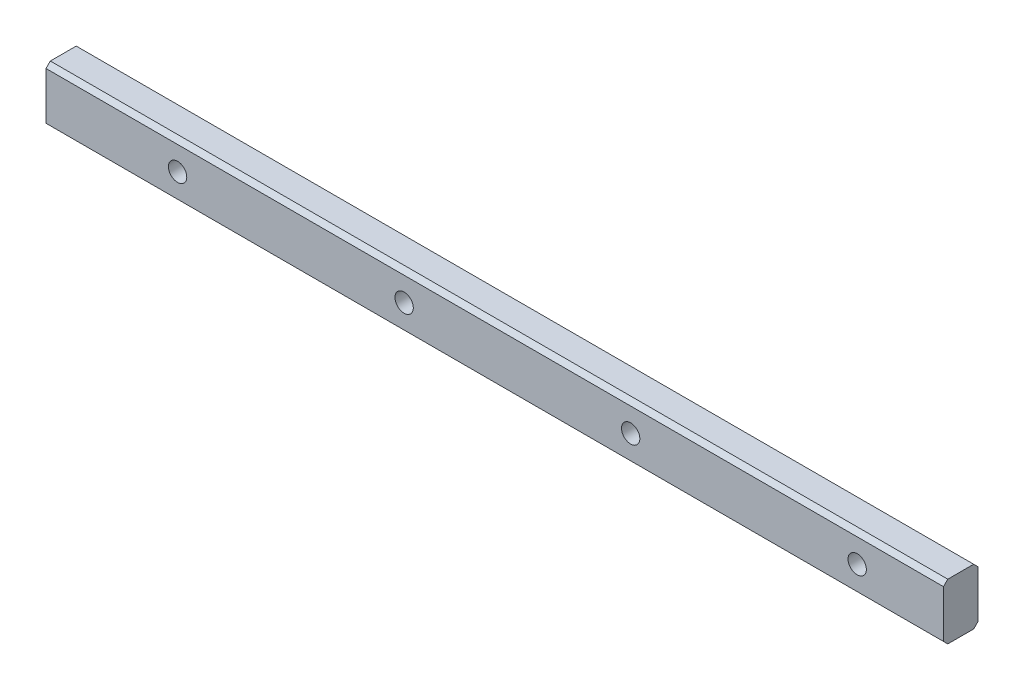
ISO-10303-21;
HEADER;
FILE_DESCRIPTION(('STEP AP214'),'2;1');
FILE_NAME('part.step','',(''),(''),'','','');
FILE_SCHEMA(('AUTOMOTIVE_DESIGN { 1 0 10303 214 1 1 1 1 }'));
ENDSEC;
DATA;
#1=APPLICATION_CONTEXT('core data for automotive mechanical design processes');
#2=APPLICATION_PROTOCOL_DEFINITION('international standard','automotive_design',2000,#1);
#3=PRODUCT_CONTEXT('',#1,'mechanical');
#4=PRODUCT('Part','Part','',(#3));
#5=PRODUCT_RELATED_PRODUCT_CATEGORY('part','',(#4));
#6=PRODUCT_DEFINITION_FORMATION('','',#4);
#7=PRODUCT_DEFINITION_CONTEXT('part definition',#1,'design');
#8=PRODUCT_DEFINITION('design','',#6,#7);
#9=PRODUCT_DEFINITION_SHAPE('','',#8);
#10=(LENGTH_UNIT() NAMED_UNIT(*) SI_UNIT(.MILLI.,.METRE.));
#11=(NAMED_UNIT(*) PLANE_ANGLE_UNIT() SI_UNIT($,.RADIAN.));
#12=(NAMED_UNIT(*) SI_UNIT($,.STERADIAN.) SOLID_ANGLE_UNIT());
#13=UNCERTAINTY_MEASURE_WITH_UNIT(LENGTH_MEASURE(1.E-05),#10,'distance_accuracy_value','');
#14=(GEOMETRIC_REPRESENTATION_CONTEXT(3) GLOBAL_UNCERTAINTY_ASSIGNED_CONTEXT((#13)) GLOBAL_UNIT_ASSIGNED_CONTEXT((#10,
#11,#12)) REPRESENTATION_CONTEXT('',''));
#15=CARTESIAN_POINT('',(0.,0.,0.));
#16=DIRECTION('',(0.,0.,1.));
#17=DIRECTION('',(1.,0.,0.));
#18=AXIS2_PLACEMENT_3D('',#15,#16,#17);
#19=CARTESIAN_POINT('',(208.,14.0000000000001,16.));
#20=DIRECTION('',(-1.,0.,0.));
#21=DIRECTION('',(0.,0.,1.));
#22=AXIS2_PLACEMENT_3D('',#19,#20,#21);
#23=PLANE('',#22);
#24=DIRECTION('',(0.,0.,-1.));
#25=VECTOR('',#24,1.);
#26=CARTESIAN_POINT('',(208.,-13.,16.));
#27=LINE('',#26,#25);
#28=CARTESIAN_POINT('',(208.,-13.,14.0000000000001));
#29=VERTEX_POINT('',#28);
#30=CARTESIAN_POINT('',(208.,-13.,2.));
#31=VERTEX_POINT('',#30);
#32=EDGE_CURVE('E106',#29,#31,#27,.T.);
#33=ORIENTED_EDGE('',*,*,#32,.T.);
#34=DIRECTION('',(0.,-0.707106781186548,0.707106781186548));
#35=VECTOR('',#34,1.);
#36=CARTESIAN_POINT('',(208.,-11.,0.));
#37=LINE('',#36,#35);
#38=CARTESIAN_POINT('',(208.,-11.,0.));
#39=VERTEX_POINT('',#38);
#40=EDGE_CURVE('E102',#31,#39,#37,.F.);
#41=ORIENTED_EDGE('',*,*,#40,.T.);
#42=DIRECTION('',(0.,1.,0.));
#43=VECTOR('',#42,1.);
#44=CARTESIAN_POINT('',(208.,14.0000000000001,0.));
#45=LINE('',#44,#43);
#46=CARTESIAN_POINT('',(208.,11.,0.));
#47=VERTEX_POINT('',#46);
#48=EDGE_CURVE('E104',#39,#47,#45,.T.);
#49=ORIENTED_EDGE('',*,*,#48,.T.);
#50=DIRECTION('',(0.,-0.707106781186548,-0.707106781186547));
#51=VECTOR('',#50,1.);
#52=CARTESIAN_POINT('',(208.,13.,1.99999999999995));
#53=LINE('',#52,#51);
#54=CARTESIAN_POINT('',(208.,13.,1.99999999999995));
#55=VERTEX_POINT('',#54);
#56=EDGE_CURVE('E59',#47,#55,#53,.F.);
#57=ORIENTED_EDGE('',*,*,#56,.T.);
#58=DIRECTION('',(0.,0.,1.));
#59=VECTOR('',#58,1.);
#60=CARTESIAN_POINT('',(208.,13.,16.));
#61=LINE('',#60,#59);
#62=CARTESIAN_POINT('',(208.,13.,14.));
#63=VERTEX_POINT('',#62);
#64=EDGE_CURVE('E120',#55,#63,#61,.T.);
#65=ORIENTED_EDGE('',*,*,#64,.T.);
#66=DIRECTION('',(0.,-0.707106781186548,0.707106781186547));
#67=VECTOR('',#66,1.);
#68=CARTESIAN_POINT('',(208.,11.,16.));
#69=LINE('',#68,#67);
#70=CARTESIAN_POINT('',(208.,11.,16.));
#71=VERTEX_POINT('',#70);
#72=EDGE_CURVE('E141',#63,#71,#69,.T.);
#73=ORIENTED_EDGE('',*,*,#72,.T.);
#74=DIRECTION('',(0.,1.,0.));
#75=VECTOR('',#74,1.);
#76=CARTESIAN_POINT('',(208.,14.0000000000001,16.));
#77=LINE('',#76,#75);
#78=CARTESIAN_POINT('',(208.,-11.0000000000001,16.));
#79=VERTEX_POINT('',#78);
#80=EDGE_CURVE('E158',#79,#71,#77,.T.);
#81=ORIENTED_EDGE('',*,*,#80,.F.);
#82=DIRECTION('',(0.,-0.707106781186548,-0.707106781186548));
#83=VECTOR('',#82,1.);
#84=CARTESIAN_POINT('',(208.,-13.,14.0000000000001));
#85=LINE('',#84,#83);
#86=EDGE_CURVE('E143',#79,#29,#85,.T.);
#87=ORIENTED_EDGE('',*,*,#86,.T.);
#88=EDGE_LOOP('',(#33,#41,#49,#57,#65,#73,#81,#87));
#89=FACE_BOUND('',#88,.T.);
#90=ADVANCED_FACE('F37',(#89),#23,.F.);
#91=CARTESIAN_POINT('',(-208.,14.,16.));
#92=DIRECTION('',(1.,0.,0.));
#93=DIRECTION('',(0.,0.,-1.));
#94=AXIS2_PLACEMENT_3D('',#91,#92,#93);
#95=PLANE('',#94);
#96=DIRECTION('',(0.,-1.,0.));
#97=VECTOR('',#96,1.);
#98=CARTESIAN_POINT('',(-208.,14.,0.));
#99=LINE('',#98,#97);
#100=CARTESIAN_POINT('',(-208.,11.,0.));
#101=VERTEX_POINT('',#100);
#102=CARTESIAN_POINT('',(-208.,-11.,0.));
#103=VERTEX_POINT('',#102);
#104=EDGE_CURVE('E119',#101,#103,#99,.T.);
#105=ORIENTED_EDGE('',*,*,#104,.T.);
#106=DIRECTION('',(0.,0.707106781186548,-0.707106781186548));
#107=VECTOR('',#106,1.);
#108=CARTESIAN_POINT('',(-208.,-11.,0.));
#109=LINE('',#108,#107);
#110=CARTESIAN_POINT('',(-208.,-13.,2.));
#111=VERTEX_POINT('',#110);
#112=EDGE_CURVE('E123',#103,#111,#109,.F.);
#113=ORIENTED_EDGE('',*,*,#112,.T.);
#114=DIRECTION('',(0.,0.,-1.));
#115=VECTOR('',#114,1.);
#116=CARTESIAN_POINT('',(-208.,-13.,16.));
#117=LINE('',#116,#115);
#118=CARTESIAN_POINT('',(-208.,-13.,14.0000000000001));
#119=VERTEX_POINT('',#118);
#120=EDGE_CURVE('E175',#119,#111,#117,.T.);
#121=ORIENTED_EDGE('',*,*,#120,.F.);
#122=DIRECTION('',(0.,0.707106781186548,0.707106781186548));
#123=VECTOR('',#122,1.);
#124=CARTESIAN_POINT('',(-208.,-13.,14.0000000000001));
#125=LINE('',#124,#123);
#126=CARTESIAN_POINT('',(-208.,-11.0000000000001,16.));
#127=VERTEX_POINT('',#126);
#128=EDGE_CURVE('E126',#119,#127,#125,.T.);
#129=ORIENTED_EDGE('',*,*,#128,.T.);
#130=DIRECTION('',(0.,-1.,0.));
#131=VECTOR('',#130,1.);
#132=CARTESIAN_POINT('',(-208.,14.,16.));
#133=LINE('',#132,#131);
#134=CARTESIAN_POINT('',(-208.,11.,16.));
#135=VERTEX_POINT('',#134);
#136=EDGE_CURVE('E128',#135,#127,#133,.T.);
#137=ORIENTED_EDGE('',*,*,#136,.F.);
#138=DIRECTION('',(0.,0.707106781186548,-0.707106781186547));
#139=VECTOR('',#138,1.);
#140=CARTESIAN_POINT('',(-208.,11.,16.));
#141=LINE('',#140,#139);
#142=CARTESIAN_POINT('',(-208.,13.,14.));
#143=VERTEX_POINT('',#142);
#144=EDGE_CURVE('E124',#135,#143,#141,.T.);
#145=ORIENTED_EDGE('',*,*,#144,.T.);
#146=DIRECTION('',(0.,0.,1.));
#147=VECTOR('',#146,1.);
#148=CARTESIAN_POINT('',(-208.,13.,16.));
#149=LINE('',#148,#147);
#150=CARTESIAN_POINT('',(-208.,13.,1.99999999999995));
#151=VERTEX_POINT('',#150);
#152=EDGE_CURVE('E173',#151,#143,#149,.T.);
#153=ORIENTED_EDGE('',*,*,#152,.F.);
#154=DIRECTION('',(0.,0.707106781186548,0.707106781186547));
#155=VECTOR('',#154,1.);
#156=CARTESIAN_POINT('',(-208.,13.,1.99999999999995));
#157=LINE('',#156,#155);
#158=EDGE_CURVE('E133',#151,#101,#157,.F.);
#159=ORIENTED_EDGE('',*,*,#158,.T.);
#160=EDGE_LOOP('',(#105,#113,#121,#129,#137,#145,#153,#159));
#161=FACE_BOUND('',#160,.T.);
#162=ADVANCED_FACE('F162',(#161),#95,.F.);
#163=CARTESIAN_POINT('',(208.,-14.0000000000001,16.));
#164=DIRECTION('',(0.,0.,1.));
#165=DIRECTION('',(1.,0.,0.));
#166=AXIS2_PLACEMENT_3D('',#163,#164,#165);
#167=PLANE('',#166);
#168=CARTESIAN_POINT('',(-147.,0.,16.));
#169=DIRECTION('',(0.,0.,1.));
#170=DIRECTION('',(1.,0.,0.));
#171=AXIS2_PLACEMENT_3D('',#168,#169,#170);
#172=CIRCLE('',#171,4.24999999999998);
#173=CARTESIAN_POINT('',(-142.75,0.,16.));
#174=VERTEX_POINT('',#173);
#175=EDGE_CURVE('E200',#174,#174,#172,.T.);
#176=ORIENTED_EDGE('',*,*,#175,.F.);
#177=EDGE_LOOP('',(#176));
#178=FACE_BOUND('',#177,.T.);
#179=CARTESIAN_POINT('',(-42.,0.,16.));
#180=DIRECTION('',(0.,0.,1.));
#181=DIRECTION('',(1.,0.,0.));
#182=AXIS2_PLACEMENT_3D('',#179,#180,#181);
#183=CIRCLE('',#182,4.24999999999996);
#184=CARTESIAN_POINT('',(-37.75,0.,16.));
#185=VERTEX_POINT('',#184);
#186=EDGE_CURVE('E194',#185,#185,#183,.T.);
#187=ORIENTED_EDGE('',*,*,#186,.F.);
#188=EDGE_LOOP('',(#187));
#189=FACE_BOUND('',#188,.T.);
#190=CARTESIAN_POINT('',(63.,0.,16.));
#191=DIRECTION('',(0.,0.,1.));
#192=DIRECTION('',(1.,0.,0.));
#193=AXIS2_PLACEMENT_3D('',#190,#191,#192);
#194=CIRCLE('',#193,4.24999999999996);
#195=CARTESIAN_POINT('',(67.2499999999999,0.,16.));
#196=VERTEX_POINT('',#195);
#197=EDGE_CURVE('E188',#196,#196,#194,.T.);
#198=ORIENTED_EDGE('',*,*,#197,.F.);
#199=EDGE_LOOP('',(#198));
#200=FACE_BOUND('',#199,.T.);
#201=CARTESIAN_POINT('',(168.,0.,16.));
#202=DIRECTION('',(0.,0.,1.));
#203=DIRECTION('',(1.,0.,0.));
#204=AXIS2_PLACEMENT_3D('',#201,#202,#203);
#205=CIRCLE('',#204,4.24999999999998);
#206=CARTESIAN_POINT('',(172.25,0.,16.));
#207=VERTEX_POINT('',#206);
#208=EDGE_CURVE('E182',#207,#207,#205,.T.);
#209=ORIENTED_EDGE('',*,*,#208,.F.);
#210=EDGE_LOOP('',(#209));
#211=FACE_BOUND('',#210,.T.);
#212=ORIENTED_EDGE('',*,*,#136,.T.);
#213=DIRECTION('',(1.,0.,0.));
#214=VECTOR('',#213,1.);
#215=CARTESIAN_POINT('',(208.,-11.0000000000001,16.));
#216=LINE('',#215,#214);
#217=EDGE_CURVE('E11',#127,#79,#216,.T.);
#218=ORIENTED_EDGE('',*,*,#217,.T.);
#219=ORIENTED_EDGE('',*,*,#80,.T.);
#220=DIRECTION('',(-1.,0.,0.));
#221=VECTOR('',#220,1.);
#222=CARTESIAN_POINT('',(-208.,11.,16.));
#223=LINE('',#222,#221);
#224=EDGE_CURVE('E45',#71,#135,#223,.T.);
#225=ORIENTED_EDGE('',*,*,#224,.T.);
#226=EDGE_LOOP('',(#212,#218,#219,#225));
#227=FACE_BOUND('',#226,.T.);
#228=ADVANCED_FACE('F155',(#178,#189,#200,#211,#227),#167,.T.);
#229=CARTESIAN_POINT('',(208.,-14.0000000000001,0.));
#230=DIRECTION('',(0.,0.,1.));
#231=DIRECTION('',(1.,0.,0.));
#232=AXIS2_PLACEMENT_3D('',#229,#230,#231);
#233=PLANE('',#232);
#234=CARTESIAN_POINT('',(-147.,0.,0.));
#235=DIRECTION('',(0.,0.,1.));
#236=DIRECTION('',(1.,0.,0.));
#237=AXIS2_PLACEMENT_3D('',#234,#235,#236);
#238=CIRCLE('',#237,4.24999999999998);
#239=CARTESIAN_POINT('',(-142.75,0.,0.));
#240=VERTEX_POINT('',#239);
#241=EDGE_CURVE('E197',#240,#240,#238,.T.);
#242=ORIENTED_EDGE('',*,*,#241,.T.);
#243=EDGE_LOOP('',(#242));
#244=FACE_BOUND('',#243,.T.);
#245=CARTESIAN_POINT('',(-42.,0.,0.));
#246=DIRECTION('',(0.,0.,1.));
#247=DIRECTION('',(1.,0.,0.));
#248=AXIS2_PLACEMENT_3D('',#245,#246,#247);
#249=CIRCLE('',#248,4.24999999999996);
#250=CARTESIAN_POINT('',(-37.75,0.,0.));
#251=VERTEX_POINT('',#250);
#252=EDGE_CURVE('E191',#251,#251,#249,.T.);
#253=ORIENTED_EDGE('',*,*,#252,.T.);
#254=EDGE_LOOP('',(#253));
#255=FACE_BOUND('',#254,.T.);
#256=CARTESIAN_POINT('',(63.,0.,0.));
#257=DIRECTION('',(0.,0.,1.));
#258=DIRECTION('',(1.,0.,0.));
#259=AXIS2_PLACEMENT_3D('',#256,#257,#258);
#260=CIRCLE('',#259,4.24999999999996);
#261=CARTESIAN_POINT('',(67.2499999999999,0.,0.));
#262=VERTEX_POINT('',#261);
#263=EDGE_CURVE('E185',#262,#262,#260,.T.);
#264=ORIENTED_EDGE('',*,*,#263,.T.);
#265=EDGE_LOOP('',(#264));
#266=FACE_BOUND('',#265,.T.);
#267=CARTESIAN_POINT('',(168.,0.,0.));
#268=DIRECTION('',(0.,0.,1.));
#269=DIRECTION('',(1.,0.,0.));
#270=AXIS2_PLACEMENT_3D('',#267,#268,#269);
#271=CIRCLE('',#270,4.24999999999998);
#272=CARTESIAN_POINT('',(172.25,0.,0.));
#273=VERTEX_POINT('',#272);
#274=EDGE_CURVE('E178',#273,#273,#271,.T.);
#275=ORIENTED_EDGE('',*,*,#274,.T.);
#276=EDGE_LOOP('',(#275));
#277=FACE_BOUND('',#276,.T.);
#278=ORIENTED_EDGE('',*,*,#48,.F.);
#279=DIRECTION('',(-1.,0.,0.));
#280=VECTOR('',#279,1.);
#281=CARTESIAN_POINT('',(208.,-11.,0.));
#282=LINE('',#281,#280);
#283=EDGE_CURVE('E115',#39,#103,#282,.T.);
#284=ORIENTED_EDGE('',*,*,#283,.T.);
#285=ORIENTED_EDGE('',*,*,#104,.F.);
#286=DIRECTION('',(1.,0.,0.));
#287=VECTOR('',#286,1.);
#288=CARTESIAN_POINT('',(208.,11.,0.));
#289=LINE('',#288,#287);
#290=EDGE_CURVE('E118',#101,#47,#289,.T.);
#291=ORIENTED_EDGE('',*,*,#290,.T.);
#292=EDGE_LOOP('',(#278,#284,#285,#291));
#293=FACE_BOUND('',#292,.T.);
#294=ADVANCED_FACE('F113',(#244,#255,#266,#277,#293),#233,.F.);
#295=CARTESIAN_POINT('',(208.,13.,16.));
#296=DIRECTION('',(0.,-1.,0.));
#297=DIRECTION('',(0.,0.,-1.));
#298=AXIS2_PLACEMENT_3D('',#295,#296,#297);
#299=PLANE('',#298);
#300=ORIENTED_EDGE('',*,*,#64,.F.);
#301=DIRECTION('',(-1.,0.,0.));
#302=VECTOR('',#301,1.);
#303=CARTESIAN_POINT('',(208.,13.,1.99999999999995));
#304=LINE('',#303,#302);
#305=EDGE_CURVE('E147',#55,#151,#304,.T.);
#306=ORIENTED_EDGE('',*,*,#305,.T.);
#307=ORIENTED_EDGE('',*,*,#152,.T.);
#308=DIRECTION('',(1.,0.,0.));
#309=VECTOR('',#308,1.);
#310=CARTESIAN_POINT('',(208.,13.,14.));
#311=LINE('',#310,#309);
#312=EDGE_CURVE('E52',#143,#63,#311,.T.);
#313=ORIENTED_EDGE('',*,*,#312,.T.);
#314=EDGE_LOOP('',(#300,#306,#307,#313));
#315=FACE_BOUND('',#314,.T.);
#316=ADVANCED_FACE('F172',(#315),#299,.F.);
#317=CARTESIAN_POINT('',(208.,-13.,16.));
#318=DIRECTION('',(0.,1.,0.));
#319=DIRECTION('',(0.,0.,1.));
#320=AXIS2_PLACEMENT_3D('',#317,#318,#319);
#321=PLANE('',#320);
#322=ORIENTED_EDGE('',*,*,#120,.T.);
#323=DIRECTION('',(1.,0.,0.));
#324=VECTOR('',#323,1.);
#325=CARTESIAN_POINT('',(208.,-13.,2.));
#326=LINE('',#325,#324);
#327=EDGE_CURVE('E139',#111,#31,#326,.T.);
#328=ORIENTED_EDGE('',*,*,#327,.T.);
#329=ORIENTED_EDGE('',*,*,#32,.F.);
#330=DIRECTION('',(-1.,0.,0.));
#331=VECTOR('',#330,1.);
#332=CARTESIAN_POINT('',(-208.,-13.,14.0000000000001));
#333=LINE('',#332,#331);
#334=EDGE_CURVE('E136',#29,#119,#333,.T.);
#335=ORIENTED_EDGE('',*,*,#334,.T.);
#336=EDGE_LOOP('',(#322,#328,#329,#335));
#337=FACE_BOUND('',#336,.T.);
#338=ADVANCED_FACE('F240',(#337),#321,.F.);
#339=CARTESIAN_POINT('',(208.,-11.,0.));
#340=DIRECTION('',(0.,0.707106781186547,0.707106781186547));
#341=DIRECTION('',(-1.,0.,0.));
#342=AXIS2_PLACEMENT_3D('',#339,#340,#341);
#343=PLANE('',#342);
#344=ORIENTED_EDGE('',*,*,#40,.F.);
#345=ORIENTED_EDGE('',*,*,#327,.F.);
#346=ORIENTED_EDGE('',*,*,#112,.F.);
#347=ORIENTED_EDGE('',*,*,#283,.F.);
#348=EDGE_LOOP('',(#344,#345,#346,#347));
#349=FACE_BOUND('',#348,.T.);
#350=ADVANCED_FACE('F122',(#349),#343,.F.);
#351=CARTESIAN_POINT('',(208.,13.,1.99999999999995));
#352=DIRECTION('',(0.,-0.707106781186547,0.707106781186548));
#353=DIRECTION('',(-1.,0.,0.));
#354=AXIS2_PLACEMENT_3D('',#351,#352,#353);
#355=PLANE('',#354);
#356=ORIENTED_EDGE('',*,*,#56,.F.);
#357=ORIENTED_EDGE('',*,*,#290,.F.);
#358=ORIENTED_EDGE('',*,*,#158,.F.);
#359=ORIENTED_EDGE('',*,*,#305,.F.);
#360=EDGE_LOOP('',(#356,#357,#358,#359));
#361=FACE_BOUND('',#360,.T.);
#362=ADVANCED_FACE('F170',(#361),#355,.F.);
#363=CARTESIAN_POINT('',(208.,-13.,14.0000000000001));
#364=DIRECTION('',(0.,-0.707106781186548,0.707106781186548));
#365=DIRECTION('',(1.,0.,0.));
#366=AXIS2_PLACEMENT_3D('',#363,#364,#365);
#367=PLANE('',#366);
#368=ORIENTED_EDGE('',*,*,#86,.F.);
#369=ORIENTED_EDGE('',*,*,#217,.F.);
#370=ORIENTED_EDGE('',*,*,#128,.F.);
#371=ORIENTED_EDGE('',*,*,#334,.F.);
#372=EDGE_LOOP('',(#368,#369,#370,#371));
#373=FACE_BOUND('',#372,.T.);
#374=ADVANCED_FACE('F227',(#373),#367,.T.);
#375=CARTESIAN_POINT('',(208.,11.,16.));
#376=DIRECTION('',(0.,0.707106781186547,0.707106781186548));
#377=DIRECTION('',(1.,0.,0.));
#378=AXIS2_PLACEMENT_3D('',#375,#376,#377);
#379=PLANE('',#378);
#380=ORIENTED_EDGE('',*,*,#72,.F.);
#381=ORIENTED_EDGE('',*,*,#312,.F.);
#382=ORIENTED_EDGE('',*,*,#144,.F.);
#383=ORIENTED_EDGE('',*,*,#224,.F.);
#384=EDGE_LOOP('',(#380,#381,#382,#383));
#385=FACE_BOUND('',#384,.T.);
#386=ADVANCED_FACE('F39',(#385),#379,.T.);
#387=CARTESIAN_POINT('',(168.,0.,16.));
#388=DIRECTION('',(0.,0.,1.));
#389=DIRECTION('',(1.,0.,0.));
#390=AXIS2_PLACEMENT_3D('',#387,#388,#389);
#391=CYLINDRICAL_SURFACE('',#390,4.24999999999998);
#392=ORIENTED_EDGE('',*,*,#274,.F.);
#393=EDGE_LOOP('',(#392));
#394=FACE_BOUND('',#393,.T.);
#395=ORIENTED_EDGE('',*,*,#208,.T.);
#396=EDGE_LOOP('',(#395));
#397=FACE_BOUND('',#396,.T.);
#398=ADVANCED_FACE('F215',(#394,#397),#391,.F.);
#399=CARTESIAN_POINT('',(63.,0.,16.));
#400=DIRECTION('',(0.,0.,1.));
#401=DIRECTION('',(1.,0.,0.));
#402=AXIS2_PLACEMENT_3D('',#399,#400,#401);
#403=CYLINDRICAL_SURFACE('',#402,4.24999999999996);
#404=ORIENTED_EDGE('',*,*,#263,.F.);
#405=EDGE_LOOP('',(#404));
#406=FACE_BOUND('',#405,.T.);
#407=ORIENTED_EDGE('',*,*,#197,.T.);
#408=EDGE_LOOP('',(#407));
#409=FACE_BOUND('',#408,.T.);
#410=ADVANCED_FACE('F217',(#406,#409),#403,.F.);
#411=CARTESIAN_POINT('',(-42.,0.,16.));
#412=DIRECTION('',(0.,0.,1.));
#413=DIRECTION('',(1.,0.,0.));
#414=AXIS2_PLACEMENT_3D('',#411,#412,#413);
#415=CYLINDRICAL_SURFACE('',#414,4.24999999999996);
#416=ORIENTED_EDGE('',*,*,#252,.F.);
#417=EDGE_LOOP('',(#416));
#418=FACE_BOUND('',#417,.T.);
#419=ORIENTED_EDGE('',*,*,#186,.T.);
#420=EDGE_LOOP('',(#419));
#421=FACE_BOUND('',#420,.T.);
#422=ADVANCED_FACE('F224',(#418,#421),#415,.F.);
#423=CARTESIAN_POINT('',(-147.,0.,16.));
#424=DIRECTION('',(0.,0.,1.));
#425=DIRECTION('',(1.,0.,0.));
#426=AXIS2_PLACEMENT_3D('',#423,#424,#425);
#427=CYLINDRICAL_SURFACE('',#426,4.24999999999998);
#428=ORIENTED_EDGE('',*,*,#241,.F.);
#429=EDGE_LOOP('',(#428));
#430=FACE_BOUND('',#429,.T.);
#431=ORIENTED_EDGE('',*,*,#175,.T.);
#432=EDGE_LOOP('',(#431));
#433=FACE_BOUND('',#432,.T.);
#434=ADVANCED_FACE('F204',(#430,#433),#427,.F.);
#435=CLOSED_SHELL('',(#90,#162,#228,#294,#316,#338,#350,#362,#374,#386,#398,#410,#422,#434));
#436=MANIFOLD_SOLID_BREP('B2',#435);
#437=ADVANCED_BREP_SHAPE_REPRESENTATION('',(#18,#436),#14);
#438=SHAPE_DEFINITION_REPRESENTATION(#9,#437);
ENDSEC;
END-ISO-10303-21;
